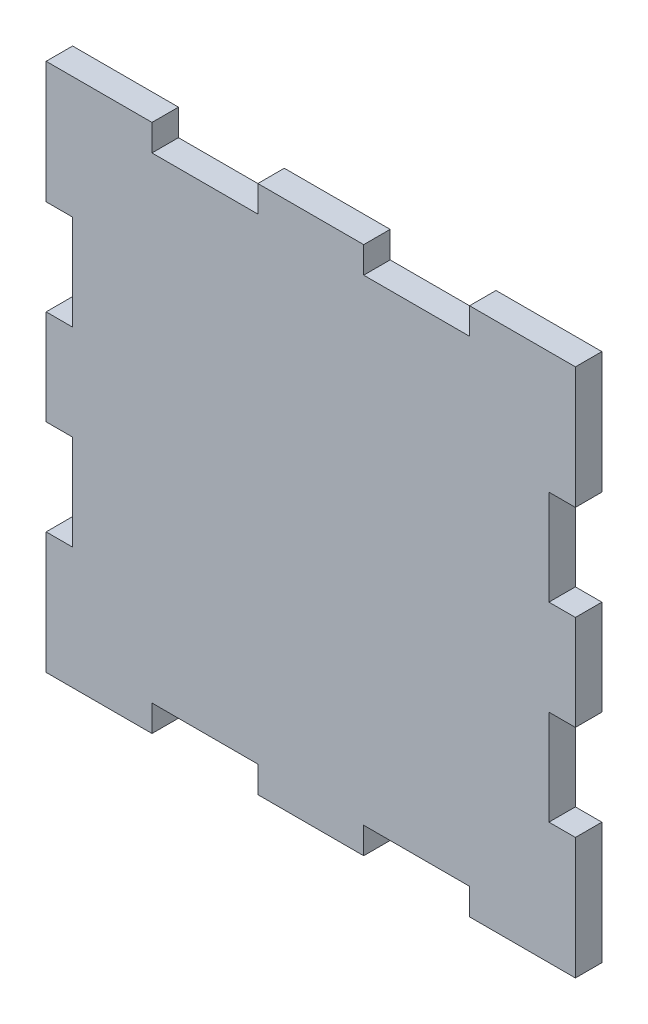
ISO-10303-21;
HEADER;
FILE_DESCRIPTION(('STEP AP214'),'2;1');
FILE_NAME('part.step','',(''),(''),'','','');
FILE_SCHEMA(('AUTOMOTIVE_DESIGN { 1 0 10303 214 1 1 1 1 }'));
ENDSEC;
DATA;
#1=APPLICATION_CONTEXT('core data for automotive mechanical design processes');
#2=APPLICATION_PROTOCOL_DEFINITION('international standard','automotive_design',2000,#1);
#3=PRODUCT_CONTEXT('',#1,'mechanical');
#4=PRODUCT('Part','Part','',(#3));
#5=PRODUCT_RELATED_PRODUCT_CATEGORY('part','',(#4));
#6=PRODUCT_DEFINITION_FORMATION('','',#4);
#7=PRODUCT_DEFINITION_CONTEXT('part definition',#1,'design');
#8=PRODUCT_DEFINITION('design','',#6,#7);
#9=PRODUCT_DEFINITION_SHAPE('','',#8);
#10=(LENGTH_UNIT() NAMED_UNIT(*) SI_UNIT(.MILLI.,.METRE.));
#11=(NAMED_UNIT(*) PLANE_ANGLE_UNIT() SI_UNIT($,.RADIAN.));
#12=(NAMED_UNIT(*) SI_UNIT($,.STERADIAN.) SOLID_ANGLE_UNIT());
#13=UNCERTAINTY_MEASURE_WITH_UNIT(LENGTH_MEASURE(1.E-05),#10,'distance_accuracy_value','');
#14=(GEOMETRIC_REPRESENTATION_CONTEXT(3) GLOBAL_UNCERTAINTY_ASSIGNED_CONTEXT((#13)) GLOBAL_UNIT_ASSIGNED_CONTEXT((#10,
#11,#12)) REPRESENTATION_CONTEXT('',''));
#15=CARTESIAN_POINT('',(0.,0.,0.));
#16=DIRECTION('',(0.,0.,1.));
#17=DIRECTION('',(1.,0.,0.));
#18=AXIS2_PLACEMENT_3D('',#15,#16,#17);
#19=CARTESIAN_POINT('',(0.,0.,5.));
#20=DIRECTION('',(-1.,0.,0.));
#21=DIRECTION('',(0.,0.,1.));
#22=AXIS2_PLACEMENT_3D('',#19,#20,#21);
#23=PLANE('',#22);
#24=DIRECTION('',(0.,1.,0.));
#25=VECTOR('',#24,1.);
#26=CARTESIAN_POINT('',(0.,0.,0.));
#27=LINE('',#26,#25);
#28=CARTESIAN_POINT('',(0.,-59.,0.));
#29=VERTEX_POINT('',#28);
#30=CARTESIAN_POINT('',(0.,-41.,0.));
#31=VERTEX_POINT('',#30);
#32=EDGE_CURVE('E507',#29,#31,#27,.T.);
#33=ORIENTED_EDGE('',*,*,#32,.T.);
#34=DIRECTION('',(0.,0.,-1.));
#35=VECTOR('',#34,1.);
#36=CARTESIAN_POINT('',(0.,-41.,5.));
#37=LINE('',#36,#35);
#38=CARTESIAN_POINT('',(0.,-41.,5.));
#39=VERTEX_POINT('',#38);
#40=EDGE_CURVE('E298',#39,#31,#37,.T.);
#41=ORIENTED_EDGE('',*,*,#40,.F.);
#42=DIRECTION('',(0.,1.,0.));
#43=VECTOR('',#42,1.);
#44=CARTESIAN_POINT('',(0.,0.,5.));
#45=LINE('',#44,#43);
#46=CARTESIAN_POINT('',(0.,-59.,5.));
#47=VERTEX_POINT('',#46);
#48=EDGE_CURVE('E487',#47,#39,#45,.T.);
#49=ORIENTED_EDGE('',*,*,#48,.F.);
#50=DIRECTION('',(0.,0.,-1.));
#51=VECTOR('',#50,1.);
#52=CARTESIAN_POINT('',(0.,-59.,5.));
#53=LINE('',#52,#51);
#54=EDGE_CURVE('E350',#47,#29,#53,.T.);
#55=ORIENTED_EDGE('',*,*,#54,.T.);
#56=EDGE_LOOP('',(#33,#41,#49,#55));
#57=FACE_BOUND('',#56,.T.);
#58=ADVANCED_FACE('F33',(#57),#23,.F.);
#59=CARTESIAN_POINT('',(0.,-100.,0.));
#60=VERTEX_POINT('',#59);
#61=CARTESIAN_POINT('',(0.,-77.,0.));
#62=VERTEX_POINT('',#61);
#63=EDGE_CURVE('E503',#60,#62,#27,.T.);
#64=ORIENTED_EDGE('',*,*,#63,.T.);
#65=DIRECTION('',(0.,0.,-1.));
#66=VECTOR('',#65,1.);
#67=CARTESIAN_POINT('',(0.,-77.,5.));
#68=LINE('',#67,#66);
#69=CARTESIAN_POINT('',(0.,-77.,5.));
#70=VERTEX_POINT('',#69);
#71=EDGE_CURVE('E320',#70,#62,#68,.T.);
#72=ORIENTED_EDGE('',*,*,#71,.F.);
#73=CARTESIAN_POINT('',(0.,-100.,5.));
#74=VERTEX_POINT('',#73);
#75=EDGE_CURVE('E483',#74,#70,#45,.T.);
#76=ORIENTED_EDGE('',*,*,#75,.F.);
#77=DIRECTION('',(0.,0.,-1.));
#78=VECTOR('',#77,1.);
#79=CARTESIAN_POINT('',(0.,-100.,5.));
#80=LINE('',#79,#78);
#81=EDGE_CURVE('E501',#74,#60,#80,.T.);
#82=ORIENTED_EDGE('',*,*,#81,.T.);
#83=EDGE_LOOP('',(#64,#72,#76,#82));
#84=FACE_BOUND('',#83,.T.);
#85=ADVANCED_FACE('F575',(#84),#23,.F.);
#86=CARTESIAN_POINT('',(0.,0.,5.));
#87=DIRECTION('',(0.,-1.,0.));
#88=DIRECTION('',(0.,0.,-1.));
#89=AXIS2_PLACEMENT_3D('',#86,#87,#88);
#90=PLANE('',#89);
#91=DIRECTION('',(-1.,0.,0.));
#92=VECTOR('',#91,1.);
#93=CARTESIAN_POINT('',(0.,0.,0.));
#94=LINE('',#93,#92);
#95=CARTESIAN_POINT('',(0.,0.,0.));
#96=VERTEX_POINT('',#95);
#97=CARTESIAN_POINT('',(-20.,0.,0.));
#98=VERTEX_POINT('',#97);
#99=EDGE_CURVE('E508',#96,#98,#94,.T.);
#100=ORIENTED_EDGE('',*,*,#99,.T.);
#101=DIRECTION('',(0.,0.,-1.));
#102=VECTOR('',#101,1.);
#103=CARTESIAN_POINT('',(-20.,0.,5.));
#104=LINE('',#103,#102);
#105=CARTESIAN_POINT('',(-20.,0.,5.));
#106=VERTEX_POINT('',#105);
#107=EDGE_CURVE('E401',#106,#98,#104,.T.);
#108=ORIENTED_EDGE('',*,*,#107,.F.);
#109=DIRECTION('',(-1.,0.,0.));
#110=VECTOR('',#109,1.);
#111=CARTESIAN_POINT('',(0.,0.,5.));
#112=LINE('',#111,#110);
#113=CARTESIAN_POINT('',(0.,0.,5.));
#114=VERTEX_POINT('',#113);
#115=EDGE_CURVE('E489',#114,#106,#112,.T.);
#116=ORIENTED_EDGE('',*,*,#115,.F.);
#117=DIRECTION('',(0.,0.,-1.));
#118=VECTOR('',#117,1.);
#119=CARTESIAN_POINT('',(0.,0.,5.));
#120=LINE('',#119,#118);
#121=EDGE_CURVE('E11',#114,#96,#120,.T.);
#122=ORIENTED_EDGE('',*,*,#121,.T.);
#123=EDGE_LOOP('',(#100,#108,#116,#122));
#124=FACE_BOUND('',#123,.T.);
#125=ADVANCED_FACE('F564',(#124),#90,.F.);
#126=CARTESIAN_POINT('',(-40.,0.,5.));
#127=VERTEX_POINT('',#126);
#128=CARTESIAN_POINT('',(-60.,0.,5.));
#129=VERTEX_POINT('',#128);
#130=EDGE_CURVE('E493',#127,#129,#112,.T.);
#131=ORIENTED_EDGE('',*,*,#130,.F.);
#132=DIRECTION('',(0.,0.,-1.));
#133=VECTOR('',#132,1.);
#134=CARTESIAN_POINT('',(-40.,0.,5.));
#135=LINE('',#134,#133);
#136=CARTESIAN_POINT('',(-40.,0.,0.));
#137=VERTEX_POINT('',#136);
#138=EDGE_CURVE('E403',#127,#137,#135,.T.);
#139=ORIENTED_EDGE('',*,*,#138,.T.);
#140=CARTESIAN_POINT('',(-60.,0.,0.));
#141=VERTEX_POINT('',#140);
#142=EDGE_CURVE('E512',#137,#141,#94,.T.);
#143=ORIENTED_EDGE('',*,*,#142,.T.);
#144=DIRECTION('',(0.,0.,-1.));
#145=VECTOR('',#144,1.);
#146=CARTESIAN_POINT('',(-60.,0.,5.));
#147=LINE('',#146,#145);
#148=EDGE_CURVE('E426',#129,#141,#147,.T.);
#149=ORIENTED_EDGE('',*,*,#148,.F.);
#150=EDGE_LOOP('',(#131,#139,#143,#149));
#151=FACE_BOUND('',#150,.T.);
#152=ADVANCED_FACE('F548',(#151),#90,.F.);
#153=CARTESIAN_POINT('',(-100.,0.,5.));
#154=DIRECTION('',(1.,0.,0.));
#155=DIRECTION('',(0.,0.,-1.));
#156=AXIS2_PLACEMENT_3D('',#153,#154,#155);
#157=PLANE('',#156);
#158=DIRECTION('',(0.,-1.,0.));
#159=VECTOR('',#158,1.);
#160=CARTESIAN_POINT('',(-100.,0.,0.));
#161=LINE('',#160,#159);
#162=CARTESIAN_POINT('',(-100.,-41.,0.));
#163=VERTEX_POINT('',#162);
#164=CARTESIAN_POINT('',(-100.,-59.,0.));
#165=VERTEX_POINT('',#164);
#166=EDGE_CURVE('E517',#163,#165,#161,.T.);
#167=ORIENTED_EDGE('',*,*,#166,.T.);
#168=DIRECTION('',(0.,0.,-1.));
#169=VECTOR('',#168,1.);
#170=CARTESIAN_POINT('',(-100.,-59.,5.));
#171=LINE('',#170,#169);
#172=CARTESIAN_POINT('',(-100.,-59.,5.));
#173=VERTEX_POINT('',#172);
#174=EDGE_CURVE('E450',#173,#165,#171,.T.);
#175=ORIENTED_EDGE('',*,*,#174,.F.);
#176=DIRECTION('',(0.,-1.,0.));
#177=VECTOR('',#176,1.);
#178=CARTESIAN_POINT('',(-100.,0.,5.));
#179=LINE('',#178,#177);
#180=CARTESIAN_POINT('',(-100.,-41.,5.));
#181=VERTEX_POINT('',#180);
#182=EDGE_CURVE('E497',#181,#173,#179,.T.);
#183=ORIENTED_EDGE('',*,*,#182,.F.);
#184=DIRECTION('',(0.,0.,-1.));
#185=VECTOR('',#184,1.);
#186=CARTESIAN_POINT('',(-100.,-41.,5.));
#187=LINE('',#186,#185);
#188=EDGE_CURVE('E276',#181,#163,#187,.T.);
#189=ORIENTED_EDGE('',*,*,#188,.T.);
#190=EDGE_LOOP('',(#167,#175,#183,#189));
#191=FACE_BOUND('',#190,.T.);
#192=ADVANCED_FACE('F572',(#191),#157,.F.);
#193=CARTESIAN_POINT('',(-100.,0.,0.));
#194=VERTEX_POINT('',#193);
#195=CARTESIAN_POINT('',(-100.,-23.,0.));
#196=VERTEX_POINT('',#195);
#197=EDGE_CURVE('E513',#194,#196,#161,.T.);
#198=ORIENTED_EDGE('',*,*,#197,.T.);
#199=DIRECTION('',(0.,0.,-1.));
#200=VECTOR('',#199,1.);
#201=CARTESIAN_POINT('',(-100.,-23.,5.));
#202=LINE('',#201,#200);
#203=CARTESIAN_POINT('',(-100.,-23.,5.));
#204=VERTEX_POINT('',#203);
#205=EDGE_CURVE('E303',#204,#196,#202,.T.);
#206=ORIENTED_EDGE('',*,*,#205,.F.);
#207=CARTESIAN_POINT('',(-100.,0.,5.));
#208=VERTEX_POINT('',#207);
#209=EDGE_CURVE('E494',#208,#204,#179,.T.);
#210=ORIENTED_EDGE('',*,*,#209,.F.);
#211=DIRECTION('',(0.,0.,-1.));
#212=VECTOR('',#211,1.);
#213=CARTESIAN_POINT('',(-100.,0.,5.));
#214=LINE('',#213,#212);
#215=EDGE_CURVE('E41',#208,#194,#214,.T.);
#216=ORIENTED_EDGE('',*,*,#215,.T.);
#217=EDGE_LOOP('',(#198,#206,#210,#216));
#218=FACE_BOUND('',#217,.T.);
#219=ADVANCED_FACE('F531',(#218),#157,.F.);
#220=CARTESIAN_POINT('',(0.,-100.,5.));
#221=DIRECTION('',(0.,1.,0.));
#222=DIRECTION('',(0.,0.,1.));
#223=AXIS2_PLACEMENT_3D('',#220,#221,#222);
#224=PLANE('',#223);
#225=DIRECTION('',(1.,0.,0.));
#226=VECTOR('',#225,1.);
#227=CARTESIAN_POINT('',(0.,-100.,0.));
#228=LINE('',#227,#226);
#229=CARTESIAN_POINT('',(-60.,-100.,0.));
#230=VERTEX_POINT('',#229);
#231=CARTESIAN_POINT('',(-40.,-100.,0.));
#232=VERTEX_POINT('',#231);
#233=EDGE_CURVE('E521',#230,#232,#228,.T.);
#234=ORIENTED_EDGE('',*,*,#233,.T.);
#235=DIRECTION('',(0.,0.,-1.));
#236=VECTOR('',#235,1.);
#237=CARTESIAN_POINT('',(-40.,-100.,5.));
#238=LINE('',#237,#236);
#239=CARTESIAN_POINT('',(-40.,-100.,5.));
#240=VERTEX_POINT('',#239);
#241=EDGE_CURVE('E374',#240,#232,#238,.T.);
#242=ORIENTED_EDGE('',*,*,#241,.F.);
#243=DIRECTION('',(1.,0.,0.));
#244=VECTOR('',#243,1.);
#245=CARTESIAN_POINT('',(0.,-100.,5.));
#246=LINE('',#245,#244);
#247=CARTESIAN_POINT('',(-60.,-100.,5.));
#248=VERTEX_POINT('',#247);
#249=EDGE_CURVE('E502',#248,#240,#246,.T.);
#250=ORIENTED_EDGE('',*,*,#249,.F.);
#251=DIRECTION('',(0.,0.,-1.));
#252=VECTOR('',#251,1.);
#253=CARTESIAN_POINT('',(-60.,-100.,5.));
#254=LINE('',#253,#252);
#255=EDGE_CURVE('E476',#248,#230,#254,.T.);
#256=ORIENTED_EDGE('',*,*,#255,.T.);
#257=EDGE_LOOP('',(#234,#242,#250,#256));
#258=FACE_BOUND('',#257,.T.);
#259=ADVANCED_FACE('F625',(#258),#224,.F.);
#260=CARTESIAN_POINT('',(-100.,-100.,0.));
#261=VERTEX_POINT('',#260);
#262=CARTESIAN_POINT('',(-80.,-100.,0.));
#263=VERTEX_POINT('',#262);
#264=EDGE_CURVE('E518',#261,#263,#228,.T.);
#265=ORIENTED_EDGE('',*,*,#264,.T.);
#266=DIRECTION('',(0.,0.,-1.));
#267=VECTOR('',#266,1.);
#268=CARTESIAN_POINT('',(-80.,-100.,5.));
#269=LINE('',#268,#267);
#270=CARTESIAN_POINT('',(-80.,-100.,5.));
#271=VERTEX_POINT('',#270);
#272=EDGE_CURVE('E473',#271,#263,#269,.T.);
#273=ORIENTED_EDGE('',*,*,#272,.F.);
#274=CARTESIAN_POINT('',(-100.,-100.,5.));
#275=VERTEX_POINT('',#274);
#276=EDGE_CURVE('E498',#275,#271,#246,.T.);
#277=ORIENTED_EDGE('',*,*,#276,.F.);
#278=DIRECTION('',(0.,0.,-1.));
#279=VECTOR('',#278,1.);
#280=CARTESIAN_POINT('',(-100.,-100.,5.));
#281=LINE('',#280,#279);
#282=EDGE_CURVE('E524',#275,#261,#281,.T.);
#283=ORIENTED_EDGE('',*,*,#282,.T.);
#284=EDGE_LOOP('',(#265,#273,#277,#283));
#285=FACE_BOUND('',#284,.T.);
#286=ADVANCED_FACE('F573',(#285),#224,.F.);
#287=CARTESIAN_POINT('',(0.,-23.,5.));
#288=VERTEX_POINT('',#287);
#289=EDGE_CURVE('E488',#288,#114,#45,.T.);
#290=ORIENTED_EDGE('',*,*,#289,.F.);
#291=DIRECTION('',(0.,0.,-1.));
#292=VECTOR('',#291,1.);
#293=CARTESIAN_POINT('',(0.,-23.,5.));
#294=LINE('',#293,#292);
#295=CARTESIAN_POINT('',(0.,-23.,0.));
#296=VERTEX_POINT('',#295);
#297=EDGE_CURVE('E325',#288,#296,#294,.T.);
#298=ORIENTED_EDGE('',*,*,#297,.T.);
#299=EDGE_CURVE('E475',#296,#96,#27,.T.);
#300=ORIENTED_EDGE('',*,*,#299,.T.);
#301=ORIENTED_EDGE('',*,*,#121,.F.);
#302=EDGE_LOOP('',(#290,#298,#300,#301));
#303=FACE_BOUND('',#302,.T.);
#304=ADVANCED_FACE('F35',(#303),#23,.F.);
#305=CARTESIAN_POINT('',(-80.,0.,5.));
#306=VERTEX_POINT('',#305);
#307=EDGE_CURVE('E486',#306,#208,#112,.T.);
#308=ORIENTED_EDGE('',*,*,#307,.F.);
#309=DIRECTION('',(0.,0.,-1.));
#310=VECTOR('',#309,1.);
#311=CARTESIAN_POINT('',(-80.,0.,5.));
#312=LINE('',#311,#310);
#313=CARTESIAN_POINT('',(-80.,0.,0.));
#314=VERTEX_POINT('',#313);
#315=EDGE_CURVE('E428',#306,#314,#312,.T.);
#316=ORIENTED_EDGE('',*,*,#315,.T.);
#317=EDGE_CURVE('E506',#314,#194,#94,.T.);
#318=ORIENTED_EDGE('',*,*,#317,.T.);
#319=ORIENTED_EDGE('',*,*,#215,.F.);
#320=EDGE_LOOP('',(#308,#316,#318,#319));
#321=FACE_BOUND('',#320,.T.);
#322=ADVANCED_FACE('F561',(#321),#90,.F.);
#323=CARTESIAN_POINT('',(-100.,-77.,5.));
#324=VERTEX_POINT('',#323);
#325=EDGE_CURVE('E492',#324,#275,#179,.T.);
#326=ORIENTED_EDGE('',*,*,#325,.F.);
#327=DIRECTION('',(0.,0.,-1.));
#328=VECTOR('',#327,1.);
#329=CARTESIAN_POINT('',(-100.,-77.,5.));
#330=LINE('',#329,#328);
#331=CARTESIAN_POINT('',(-100.,-77.,0.));
#332=VERTEX_POINT('',#331);
#333=EDGE_CURVE('E452',#324,#332,#330,.T.);
#334=ORIENTED_EDGE('',*,*,#333,.T.);
#335=EDGE_CURVE('E511',#332,#261,#161,.T.);
#336=ORIENTED_EDGE('',*,*,#335,.T.);
#337=ORIENTED_EDGE('',*,*,#282,.F.);
#338=EDGE_LOOP('',(#326,#334,#336,#337));
#339=FACE_BOUND('',#338,.T.);
#340=ADVANCED_FACE('F563',(#339),#157,.F.);
#341=CARTESIAN_POINT('',(-20.,-100.,5.));
#342=VERTEX_POINT('',#341);
#343=EDGE_CURVE('E496',#342,#74,#246,.T.);
#344=ORIENTED_EDGE('',*,*,#343,.F.);
#345=DIRECTION('',(0.,0.,-1.));
#346=VECTOR('',#345,1.);
#347=CARTESIAN_POINT('',(-20.,-100.,5.));
#348=LINE('',#347,#346);
#349=CARTESIAN_POINT('',(-20.,-100.,0.));
#350=VERTEX_POINT('',#349);
#351=EDGE_CURVE('E377',#342,#350,#348,.T.);
#352=ORIENTED_EDGE('',*,*,#351,.T.);
#353=EDGE_CURVE('E516',#350,#60,#228,.T.);
#354=ORIENTED_EDGE('',*,*,#353,.T.);
#355=ORIENTED_EDGE('',*,*,#81,.F.);
#356=EDGE_LOOP('',(#344,#352,#354,#355));
#357=FACE_BOUND('',#356,.T.);
#358=ADVANCED_FACE('F569',(#357),#224,.F.);
#359=CARTESIAN_POINT('',(0.,0.,5.));
#360=DIRECTION('',(0.,0.,-1.));
#361=DIRECTION('',(-1.,0.,0.));
#362=AXIS2_PLACEMENT_3D('',#359,#360,#361);
#363=PLANE('',#362);
#364=ORIENTED_EDGE('',*,*,#249,.T.);
#365=DIRECTION('',(0.,1.,0.));
#366=VECTOR('',#365,1.);
#367=CARTESIAN_POINT('',(-40.,-95.0000000000003,5.));
#368=LINE('',#367,#366);
#369=CARTESIAN_POINT('',(-40.,-95.0000000000003,5.));
#370=VERTEX_POINT('',#369);
#371=EDGE_CURVE('E357',#240,#370,#368,.T.);
#372=ORIENTED_EDGE('',*,*,#371,.T.);
#373=DIRECTION('',(1.,0.,0.));
#374=VECTOR('',#373,1.);
#375=CARTESIAN_POINT('',(-40.,-95.0000000000003,5.));
#376=LINE('',#375,#374);
#377=CARTESIAN_POINT('',(-20.,-95.0000000000003,5.));
#378=VERTEX_POINT('',#377);
#379=EDGE_CURVE('E360',#370,#378,#376,.T.);
#380=ORIENTED_EDGE('',*,*,#379,.T.);
#381=DIRECTION('',(0.,-1.,0.));
#382=VECTOR('',#381,1.);
#383=CARTESIAN_POINT('',(-20.,-95.0000000000003,5.));
#384=LINE('',#383,#382);
#385=EDGE_CURVE('E364',#378,#342,#384,.T.);
#386=ORIENTED_EDGE('',*,*,#385,.T.);
#387=ORIENTED_EDGE('',*,*,#343,.T.);
#388=ORIENTED_EDGE('',*,*,#75,.T.);
#389=DIRECTION('',(-1.,0.,0.));
#390=VECTOR('',#389,1.);
#391=CARTESIAN_POINT('',(-4.99999999999973,-77.,5.));
#392=LINE('',#391,#390);
#393=CARTESIAN_POINT('',(-4.99999999999973,-77.,5.));
#394=VERTEX_POINT('',#393);
#395=EDGE_CURVE('E332',#70,#394,#392,.T.);
#396=ORIENTED_EDGE('',*,*,#395,.T.);
#397=DIRECTION('',(0.,1.,0.));
#398=VECTOR('',#397,1.);
#399=CARTESIAN_POINT('',(-4.99999999999973,-77.,5.));
#400=LINE('',#399,#398);
#401=CARTESIAN_POINT('',(-4.99999999999973,-59.,5.));
#402=VERTEX_POINT('',#401);
#403=EDGE_CURVE('E335',#394,#402,#400,.T.);
#404=ORIENTED_EDGE('',*,*,#403,.T.);
#405=DIRECTION('',(1.,0.,0.));
#406=VECTOR('',#405,1.);
#407=CARTESIAN_POINT('',(-4.99999999999973,-59.,5.));
#408=LINE('',#407,#406);
#409=EDGE_CURVE('E339',#402,#47,#408,.T.);
#410=ORIENTED_EDGE('',*,*,#409,.T.);
#411=ORIENTED_EDGE('',*,*,#48,.T.);
#412=DIRECTION('',(-1.,0.,0.));
#413=VECTOR('',#412,1.);
#414=CARTESIAN_POINT('',(-4.99999999999985,-41.,5.));
#415=LINE('',#414,#413);
#416=CARTESIAN_POINT('',(-4.99999999999985,-41.,5.));
#417=VERTEX_POINT('',#416);
#418=EDGE_CURVE('E306',#39,#417,#415,.T.);
#419=ORIENTED_EDGE('',*,*,#418,.T.);
#420=DIRECTION('',(0.,1.,0.));
#421=VECTOR('',#420,1.);
#422=CARTESIAN_POINT('',(-4.99999999999985,-41.,5.));
#423=LINE('',#422,#421);
#424=CARTESIAN_POINT('',(-4.99999999999985,-23.,5.));
#425=VERTEX_POINT('',#424);
#426=EDGE_CURVE('E309',#417,#425,#423,.T.);
#427=ORIENTED_EDGE('',*,*,#426,.T.);
#428=DIRECTION('',(1.,0.,0.));
#429=VECTOR('',#428,1.);
#430=CARTESIAN_POINT('',(-4.99999999999985,-23.,5.));
#431=LINE('',#430,#429);
#432=EDGE_CURVE('E313',#425,#288,#431,.T.);
#433=ORIENTED_EDGE('',*,*,#432,.T.);
#434=ORIENTED_EDGE('',*,*,#289,.T.);
#435=ORIENTED_EDGE('',*,*,#115,.T.);
#436=DIRECTION('',(0.,-1.,0.));
#437=VECTOR('',#436,1.);
#438=CARTESIAN_POINT('',(-20.,-4.99999999999966,5.));
#439=LINE('',#438,#437);
#440=CARTESIAN_POINT('',(-20.,-4.99999999999966,5.));
#441=VERTEX_POINT('',#440);
#442=EDGE_CURVE('E390',#106,#441,#439,.T.);
#443=ORIENTED_EDGE('',*,*,#442,.T.);
#444=DIRECTION('',(-1.,0.,0.));
#445=VECTOR('',#444,1.);
#446=CARTESIAN_POINT('',(-40.,-4.99999999999966,5.));
#447=LINE('',#446,#445);
#448=CARTESIAN_POINT('',(-40.,-4.99999999999966,5.));
#449=VERTEX_POINT('',#448);
#450=EDGE_CURVE('E383',#441,#449,#447,.T.);
#451=ORIENTED_EDGE('',*,*,#450,.T.);
#452=DIRECTION('',(0.,1.,0.));
#453=VECTOR('',#452,1.);
#454=CARTESIAN_POINT('',(-40.,-4.99999999999966,5.));
#455=LINE('',#454,#453);
#456=EDGE_CURVE('E386',#449,#127,#455,.T.);
#457=ORIENTED_EDGE('',*,*,#456,.T.);
#458=ORIENTED_EDGE('',*,*,#130,.T.);
#459=DIRECTION('',(0.,-1.,0.));
#460=VECTOR('',#459,1.);
#461=CARTESIAN_POINT('',(-60.,-4.99999999999966,5.));
#462=LINE('',#461,#460);
#463=CARTESIAN_POINT('',(-60.,-4.99999999999966,5.));
#464=VERTEX_POINT('',#463);
#465=EDGE_CURVE('E414',#129,#464,#462,.T.);
#466=ORIENTED_EDGE('',*,*,#465,.T.);
#467=DIRECTION('',(-1.,0.,0.));
#468=VECTOR('',#467,1.);
#469=CARTESIAN_POINT('',(-80.,-4.99999999999966,5.));
#470=LINE('',#469,#468);
#471=CARTESIAN_POINT('',(-80.,-4.99999999999966,5.));
#472=VERTEX_POINT('',#471);
#473=EDGE_CURVE('E407',#464,#472,#470,.T.);
#474=ORIENTED_EDGE('',*,*,#473,.T.);
#475=DIRECTION('',(0.,1.,0.));
#476=VECTOR('',#475,1.);
#477=CARTESIAN_POINT('',(-80.,-4.99999999999966,5.));
#478=LINE('',#477,#476);
#479=EDGE_CURVE('E410',#472,#306,#478,.T.);
#480=ORIENTED_EDGE('',*,*,#479,.T.);
#481=ORIENTED_EDGE('',*,*,#307,.T.);
#482=ORIENTED_EDGE('',*,*,#209,.T.);
#483=DIRECTION('',(1.,0.,0.));
#484=VECTOR('',#483,1.);
#485=CARTESIAN_POINT('',(-95.0000000000002,-23.,5.));
#486=LINE('',#485,#484);
#487=CARTESIAN_POINT('',(-95.0000000000002,-23.,5.));
#488=VERTEX_POINT('',#487);
#489=EDGE_CURVE('E277',#204,#488,#486,.T.);
#490=ORIENTED_EDGE('',*,*,#489,.T.);
#491=DIRECTION('',(0.,-1.,0.));
#492=VECTOR('',#491,1.);
#493=CARTESIAN_POINT('',(-95.0000000000002,-41.,5.));
#494=LINE('',#493,#492);
#495=CARTESIAN_POINT('',(-95.0000000000002,-41.,5.));
#496=VERTEX_POINT('',#495);
#497=EDGE_CURVE('E270',#488,#496,#494,.T.);
#498=ORIENTED_EDGE('',*,*,#497,.T.);
#499=DIRECTION('',(-1.,0.,0.));
#500=VECTOR('',#499,1.);
#501=CARTESIAN_POINT('',(-95.0000000000002,-41.,5.));
#502=LINE('',#501,#500);
#503=EDGE_CURVE('E280',#496,#181,#502,.T.);
#504=ORIENTED_EDGE('',*,*,#503,.T.);
#505=ORIENTED_EDGE('',*,*,#182,.T.);
#506=DIRECTION('',(1.,0.,0.));
#507=VECTOR('',#506,1.);
#508=CARTESIAN_POINT('',(-95.0000000000003,-59.,5.));
#509=LINE('',#508,#507);
#510=CARTESIAN_POINT('',(-95.0000000000003,-59.,5.));
#511=VERTEX_POINT('',#510);
#512=EDGE_CURVE('E440',#173,#511,#509,.T.);
#513=ORIENTED_EDGE('',*,*,#512,.T.);
#514=DIRECTION('',(0.,-1.,0.));
#515=VECTOR('',#514,1.);
#516=CARTESIAN_POINT('',(-95.0000000000003,-77.,5.));
#517=LINE('',#516,#515);
#518=CARTESIAN_POINT('',(-95.0000000000003,-77.,5.));
#519=VERTEX_POINT('',#518);
#520=EDGE_CURVE('E433',#511,#519,#517,.T.);
#521=ORIENTED_EDGE('',*,*,#520,.T.);
#522=DIRECTION('',(-1.,0.,0.));
#523=VECTOR('',#522,1.);
#524=CARTESIAN_POINT('',(-95.0000000000003,-77.,5.));
#525=LINE('',#524,#523);
#526=EDGE_CURVE('E436',#519,#324,#525,.T.);
#527=ORIENTED_EDGE('',*,*,#526,.T.);
#528=ORIENTED_EDGE('',*,*,#325,.T.);
#529=ORIENTED_EDGE('',*,*,#276,.T.);
#530=DIRECTION('',(0.,1.,0.));
#531=VECTOR('',#530,1.);
#532=CARTESIAN_POINT('',(-80.,-95.0000000000003,5.));
#533=LINE('',#532,#531);
#534=CARTESIAN_POINT('',(-80.,-95.0000000000003,5.));
#535=VERTEX_POINT('',#534);
#536=EDGE_CURVE('E457',#271,#535,#533,.T.);
#537=ORIENTED_EDGE('',*,*,#536,.T.);
#538=DIRECTION('',(1.,0.,0.));
#539=VECTOR('',#538,1.);
#540=CARTESIAN_POINT('',(-80.,-95.0000000000003,5.));
#541=LINE('',#540,#539);
#542=CARTESIAN_POINT('',(-60.,-95.0000000000003,5.));
#543=VERTEX_POINT('',#542);
#544=EDGE_CURVE('E460',#535,#543,#541,.T.);
#545=ORIENTED_EDGE('',*,*,#544,.T.);
#546=DIRECTION('',(0.,-1.,0.));
#547=VECTOR('',#546,1.);
#548=CARTESIAN_POINT('',(-60.,-95.0000000000003,5.));
#549=LINE('',#548,#547);
#550=EDGE_CURVE('E464',#543,#248,#549,.T.);
#551=ORIENTED_EDGE('',*,*,#550,.T.);
#552=EDGE_LOOP('',(#364,#372,#380,#386,#387,#388,#396,#404,#410,#411,#419,#427,#433,#434,#435,
#443,#451,#457,#458,#466,#474,#480,#481,#482,#490,#498,#504,#505,#513,#521,#527,#528,#529,#537,
#545,#551));
#553=FACE_BOUND('',#552,.T.);
#554=ADVANCED_FACE('F288',(#553),#363,.F.);
#555=CARTESIAN_POINT('',(0.,0.,0.));
#556=DIRECTION('',(0.,0.,-1.));
#557=DIRECTION('',(-1.,0.,0.));
#558=AXIS2_PLACEMENT_3D('',#555,#556,#557);
#559=PLANE('',#558);
#560=DIRECTION('',(0.,1.,0.));
#561=VECTOR('',#560,1.);
#562=CARTESIAN_POINT('',(-40.,-95.0000000000003,0.));
#563=LINE('',#562,#561);
#564=CARTESIAN_POINT('',(-40.,-95.0000000000003,0.));
#565=VERTEX_POINT('',#564);
#566=EDGE_CURVE('E48',#232,#565,#563,.T.);
#567=ORIENTED_EDGE('',*,*,#566,.F.);
#568=ORIENTED_EDGE('',*,*,#233,.F.);
#569=DIRECTION('',(0.,-1.,0.));
#570=VECTOR('',#569,1.);
#571=CARTESIAN_POINT('',(-60.,-95.0000000000003,0.));
#572=LINE('',#571,#570);
#573=CARTESIAN_POINT('',(-60.,-95.0000000000003,0.));
#574=VERTEX_POINT('',#573);
#575=EDGE_CURVE('E461',#574,#230,#572,.T.);
#576=ORIENTED_EDGE('',*,*,#575,.F.);
#577=DIRECTION('',(1.,0.,0.));
#578=VECTOR('',#577,1.);
#579=CARTESIAN_POINT('',(-80.,-95.0000000000003,0.));
#580=LINE('',#579,#578);
#581=CARTESIAN_POINT('',(-80.,-95.0000000000003,0.));
#582=VERTEX_POINT('',#581);
#583=EDGE_CURVE('E469',#582,#574,#580,.T.);
#584=ORIENTED_EDGE('',*,*,#583,.F.);
#585=DIRECTION('',(0.,1.,0.));
#586=VECTOR('',#585,1.);
#587=CARTESIAN_POINT('',(-80.,-95.0000000000003,0.));
#588=LINE('',#587,#586);
#589=EDGE_CURVE('E376',#263,#582,#588,.T.);
#590=ORIENTED_EDGE('',*,*,#589,.F.);
#591=ORIENTED_EDGE('',*,*,#264,.F.);
#592=ORIENTED_EDGE('',*,*,#335,.F.);
#593=DIRECTION('',(-1.,0.,0.));
#594=VECTOR('',#593,1.);
#595=CARTESIAN_POINT('',(-95.0000000000003,-77.,0.));
#596=LINE('',#595,#594);
#597=CARTESIAN_POINT('',(-95.0000000000003,-77.,0.));
#598=VERTEX_POINT('',#597);
#599=EDGE_CURVE('E445',#598,#332,#596,.T.);
#600=ORIENTED_EDGE('',*,*,#599,.F.);
#601=DIRECTION('',(0.,-1.,0.));
#602=VECTOR('',#601,1.);
#603=CARTESIAN_POINT('',(-95.0000000000003,-77.,0.));
#604=LINE('',#603,#602);
#605=CARTESIAN_POINT('',(-95.0000000000003,-59.,0.));
#606=VERTEX_POINT('',#605);
#607=EDGE_CURVE('E302',#606,#598,#604,.T.);
#608=ORIENTED_EDGE('',*,*,#607,.F.);
#609=DIRECTION('',(1.,0.,0.));
#610=VECTOR('',#609,1.);
#611=CARTESIAN_POINT('',(-95.0000000000003,-59.,0.));
#612=LINE('',#611,#610);
#613=EDGE_CURVE('E437',#165,#606,#612,.T.);
#614=ORIENTED_EDGE('',*,*,#613,.F.);
#615=ORIENTED_EDGE('',*,*,#166,.F.);
#616=DIRECTION('',(-1.,0.,0.));
#617=VECTOR('',#616,1.);
#618=CARTESIAN_POINT('',(-95.0000000000002,-41.,0.));
#619=LINE('',#618,#617);
#620=CARTESIAN_POINT('',(-95.0000000000002,-41.,0.));
#621=VERTEX_POINT('',#620);
#622=EDGE_CURVE('E293',#621,#163,#619,.T.);
#623=ORIENTED_EDGE('',*,*,#622,.F.);
#624=DIRECTION('',(0.,-1.,0.));
#625=VECTOR('',#624,1.);
#626=CARTESIAN_POINT('',(-95.0000000000002,-41.,0.));
#627=LINE('',#626,#625);
#628=CARTESIAN_POINT('',(-95.0000000000002,-23.,0.));
#629=VERTEX_POINT('',#628);
#630=EDGE_CURVE('E273',#629,#621,#627,.T.);
#631=ORIENTED_EDGE('',*,*,#630,.F.);
#632=DIRECTION('',(1.,0.,0.));
#633=VECTOR('',#632,1.);
#634=CARTESIAN_POINT('',(-95.0000000000002,-23.,0.));
#635=LINE('',#634,#633);
#636=EDGE_CURVE('E290',#196,#629,#635,.T.);
#637=ORIENTED_EDGE('',*,*,#636,.F.);
#638=ORIENTED_EDGE('',*,*,#197,.F.);
#639=ORIENTED_EDGE('',*,*,#317,.F.);
#640=DIRECTION('',(0.,1.,0.));
#641=VECTOR('',#640,1.);
#642=CARTESIAN_POINT('',(-80.,-4.99999999999966,0.));
#643=LINE('',#642,#641);
#644=CARTESIAN_POINT('',(-80.,-4.99999999999966,0.));
#645=VERTEX_POINT('',#644);
#646=EDGE_CURVE('E420',#645,#314,#643,.T.);
#647=ORIENTED_EDGE('',*,*,#646,.F.);
#648=DIRECTION('',(-1.,0.,0.));
#649=VECTOR('',#648,1.);
#650=CARTESIAN_POINT('',(-80.,-4.99999999999966,0.));
#651=LINE('',#650,#649);
#652=CARTESIAN_POINT('',(-60.,-4.99999999999966,0.));
#653=VERTEX_POINT('',#652);
#654=EDGE_CURVE('E418',#653,#645,#651,.T.);
#655=ORIENTED_EDGE('',*,*,#654,.F.);
#656=DIRECTION('',(0.,-1.,0.));
#657=VECTOR('',#656,1.);
#658=CARTESIAN_POINT('',(-60.,-4.99999999999966,0.));
#659=LINE('',#658,#657);
#660=EDGE_CURVE('E411',#141,#653,#659,.T.);
#661=ORIENTED_EDGE('',*,*,#660,.F.);
#662=ORIENTED_EDGE('',*,*,#142,.F.);
#663=DIRECTION('',(0.,1.,0.));
#664=VECTOR('',#663,1.);
#665=CARTESIAN_POINT('',(-40.,-4.99999999999966,0.));
#666=LINE('',#665,#664);
#667=CARTESIAN_POINT('',(-40.,-4.99999999999966,0.));
#668=VERTEX_POINT('',#667);
#669=EDGE_CURVE('E395',#668,#137,#666,.T.);
#670=ORIENTED_EDGE('',*,*,#669,.F.);
#671=DIRECTION('',(-1.,0.,0.));
#672=VECTOR('',#671,1.);
#673=CARTESIAN_POINT('',(-40.,-4.99999999999966,0.));
#674=LINE('',#673,#672);
#675=CARTESIAN_POINT('',(-20.,-4.99999999999966,0.));
#676=VERTEX_POINT('',#675);
#677=EDGE_CURVE('E56',#676,#668,#674,.T.);
#678=ORIENTED_EDGE('',*,*,#677,.F.);
#679=DIRECTION('',(0.,-1.,0.));
#680=VECTOR('',#679,1.);
#681=CARTESIAN_POINT('',(-20.,-4.99999999999966,0.));
#682=LINE('',#681,#680);
#683=EDGE_CURVE('E387',#98,#676,#682,.T.);
#684=ORIENTED_EDGE('',*,*,#683,.F.);
#685=ORIENTED_EDGE('',*,*,#99,.F.);
#686=ORIENTED_EDGE('',*,*,#299,.F.);
#687=DIRECTION('',(1.,0.,0.));
#688=VECTOR('',#687,1.);
#689=CARTESIAN_POINT('',(-4.99999999999985,-23.,0.));
#690=LINE('',#689,#688);
#691=CARTESIAN_POINT('',(-4.99999999999985,-23.,0.));
#692=VERTEX_POINT('',#691);
#693=EDGE_CURVE('E310',#692,#296,#690,.T.);
#694=ORIENTED_EDGE('',*,*,#693,.F.);
#695=DIRECTION('',(0.,1.,0.));
#696=VECTOR('',#695,1.);
#697=CARTESIAN_POINT('',(-4.99999999999985,-41.,0.));
#698=LINE('',#697,#696);
#699=CARTESIAN_POINT('',(-4.99999999999985,-41.,0.));
#700=VERTEX_POINT('',#699);
#701=EDGE_CURVE('E319',#700,#692,#698,.T.);
#702=ORIENTED_EDGE('',*,*,#701,.F.);
#703=DIRECTION('',(-1.,0.,0.));
#704=VECTOR('',#703,1.);
#705=CARTESIAN_POINT('',(-4.99999999999985,-41.,0.));
#706=LINE('',#705,#704);
#707=EDGE_CURVE('E317',#31,#700,#706,.T.);
#708=ORIENTED_EDGE('',*,*,#707,.F.);
#709=ORIENTED_EDGE('',*,*,#32,.F.);
#710=DIRECTION('',(1.,0.,0.));
#711=VECTOR('',#710,1.);
#712=CARTESIAN_POINT('',(-4.99999999999973,-59.,0.));
#713=LINE('',#712,#711);
#714=CARTESIAN_POINT('',(-4.99999999999973,-59.,0.));
#715=VERTEX_POINT('',#714);
#716=EDGE_CURVE('E336',#715,#29,#713,.T.);
#717=ORIENTED_EDGE('',*,*,#716,.F.);
#718=DIRECTION('',(0.,1.,0.));
#719=VECTOR('',#718,1.);
#720=CARTESIAN_POINT('',(-4.99999999999973,-77.,0.));
#721=LINE('',#720,#719);
#722=CARTESIAN_POINT('',(-4.99999999999973,-77.,0.));
#723=VERTEX_POINT('',#722);
#724=EDGE_CURVE('E345',#723,#715,#721,.T.);
#725=ORIENTED_EDGE('',*,*,#724,.F.);
#726=DIRECTION('',(-1.,0.,0.));
#727=VECTOR('',#726,1.);
#728=CARTESIAN_POINT('',(-4.99999999999973,-77.,0.));
#729=LINE('',#728,#727);
#730=EDGE_CURVE('E343',#62,#723,#729,.T.);
#731=ORIENTED_EDGE('',*,*,#730,.F.);
#732=ORIENTED_EDGE('',*,*,#63,.F.);
#733=ORIENTED_EDGE('',*,*,#353,.F.);
#734=DIRECTION('',(0.,-1.,0.));
#735=VECTOR('',#734,1.);
#736=CARTESIAN_POINT('',(-20.,-95.0000000000003,0.));
#737=LINE('',#736,#735);
#738=CARTESIAN_POINT('',(-20.,-95.0000000000003,0.));
#739=VERTEX_POINT('',#738);
#740=EDGE_CURVE('E361',#739,#350,#737,.T.);
#741=ORIENTED_EDGE('',*,*,#740,.F.);
#742=DIRECTION('',(1.,0.,0.));
#743=VECTOR('',#742,1.);
#744=CARTESIAN_POINT('',(-40.,-95.0000000000003,0.));
#745=LINE('',#744,#743);
#746=EDGE_CURVE('E369',#565,#739,#745,.T.);
#747=ORIENTED_EDGE('',*,*,#746,.F.);
#748=EDGE_LOOP('',(#567,#568,#576,#584,#590,#591,#592,#600,#608,#614,#615,#623,#631,#637,#638,
#639,#647,#655,#661,#662,#670,#678,#684,#685,#686,#694,#702,#708,#709,#717,#725,#731,#732,#733,
#741,#747));
#749=FACE_BOUND('',#748,.T.);
#750=ADVANCED_FACE('F538',(#749),#559,.T.);
#751=CARTESIAN_POINT('',(-80.,-95.0000000000003,5.));
#752=DIRECTION('',(-1.,0.,0.));
#753=DIRECTION('',(0.,0.,1.));
#754=AXIS2_PLACEMENT_3D('',#751,#752,#753);
#755=PLANE('',#754);
#756=ORIENTED_EDGE('',*,*,#589,.T.);
#757=DIRECTION('',(0.,0.,-1.));
#758=VECTOR('',#757,1.);
#759=CARTESIAN_POINT('',(-80.,-95.0000000000003,5.));
#760=LINE('',#759,#758);
#761=EDGE_CURVE('E467',#535,#582,#760,.T.);
#762=ORIENTED_EDGE('',*,*,#761,.F.);
#763=ORIENTED_EDGE('',*,*,#536,.F.);
#764=ORIENTED_EDGE('',*,*,#272,.T.);
#765=EDGE_LOOP('',(#756,#762,#763,#764));
#766=FACE_BOUND('',#765,.T.);
#767=ADVANCED_FACE('F675',(#766),#755,.F.);
#768=CARTESIAN_POINT('',(-60.,-95.0000000000003,5.));
#769=DIRECTION('',(1.,0.,0.));
#770=DIRECTION('',(0.,0.,-1.));
#771=AXIS2_PLACEMENT_3D('',#768,#769,#770);
#772=PLANE('',#771);
#773=ORIENTED_EDGE('',*,*,#575,.T.);
#774=ORIENTED_EDGE('',*,*,#255,.F.);
#775=ORIENTED_EDGE('',*,*,#550,.F.);
#776=DIRECTION('',(0.,0.,-1.));
#777=VECTOR('',#776,1.);
#778=CARTESIAN_POINT('',(-60.,-95.0000000000003,5.));
#779=LINE('',#778,#777);
#780=EDGE_CURVE('E479',#543,#574,#779,.T.);
#781=ORIENTED_EDGE('',*,*,#780,.T.);
#782=EDGE_LOOP('',(#773,#774,#775,#781));
#783=FACE_BOUND('',#782,.T.);
#784=ADVANCED_FACE('F636',(#783),#772,.F.);
#785=CARTESIAN_POINT('',(-80.,-95.0000000000003,5.));
#786=DIRECTION('',(0.,1.,0.));
#787=DIRECTION('',(0.,0.,1.));
#788=AXIS2_PLACEMENT_3D('',#785,#786,#787);
#789=PLANE('',#788);
#790=ORIENTED_EDGE('',*,*,#583,.T.);
#791=ORIENTED_EDGE('',*,*,#780,.F.);
#792=ORIENTED_EDGE('',*,*,#544,.F.);
#793=ORIENTED_EDGE('',*,*,#761,.T.);
#794=EDGE_LOOP('',(#790,#791,#792,#793));
#795=FACE_BOUND('',#794,.T.);
#796=ADVANCED_FACE('F638',(#795),#789,.F.);
#797=CARTESIAN_POINT('',(-4.99999999999973,-77.,5.));
#798=DIRECTION('',(0.,-1.,0.));
#799=DIRECTION('',(0.,0.,-1.));
#800=AXIS2_PLACEMENT_3D('',#797,#798,#799);
#801=PLANE('',#800);
#802=ORIENTED_EDGE('',*,*,#730,.T.);
#803=DIRECTION('',(0.,0.,-1.));
#804=VECTOR('',#803,1.);
#805=CARTESIAN_POINT('',(-4.99999999999973,-77.,5.));
#806=LINE('',#805,#804);
#807=EDGE_CURVE('E342',#394,#723,#806,.T.);
#808=ORIENTED_EDGE('',*,*,#807,.F.);
#809=ORIENTED_EDGE('',*,*,#395,.F.);
#810=ORIENTED_EDGE('',*,*,#71,.T.);
#811=EDGE_LOOP('',(#802,#808,#809,#810));
#812=FACE_BOUND('',#811,.T.);
#813=ADVANCED_FACE('F611',(#812),#801,.F.);
#814=CARTESIAN_POINT('',(-4.99999999999973,-59.,5.));
#815=DIRECTION('',(0.,1.,0.));
#816=DIRECTION('',(0.,0.,1.));
#817=AXIS2_PLACEMENT_3D('',#814,#815,#816);
#818=PLANE('',#817);
#819=ORIENTED_EDGE('',*,*,#716,.T.);
#820=ORIENTED_EDGE('',*,*,#54,.F.);
#821=ORIENTED_EDGE('',*,*,#409,.F.);
#822=DIRECTION('',(0.,0.,-1.));
#823=VECTOR('',#822,1.);
#824=CARTESIAN_POINT('',(-4.99999999999973,-59.,5.));
#825=LINE('',#824,#823);
#826=EDGE_CURVE('E353',#402,#715,#825,.T.);
#827=ORIENTED_EDGE('',*,*,#826,.T.);
#828=EDGE_LOOP('',(#819,#820,#821,#827));
#829=FACE_BOUND('',#828,.T.);
#830=ADVANCED_FACE('F604',(#829),#818,.F.);
#831=CARTESIAN_POINT('',(-4.99999999999973,-77.,5.));
#832=DIRECTION('',(-1.,0.,0.));
#833=DIRECTION('',(0.,0.,1.));
#834=AXIS2_PLACEMENT_3D('',#831,#832,#833);
#835=PLANE('',#834);
#836=ORIENTED_EDGE('',*,*,#724,.T.);
#837=ORIENTED_EDGE('',*,*,#826,.F.);
#838=ORIENTED_EDGE('',*,*,#403,.F.);
#839=ORIENTED_EDGE('',*,*,#807,.T.);
#840=EDGE_LOOP('',(#836,#837,#838,#839));
#841=FACE_BOUND('',#840,.T.);
#842=ADVANCED_FACE('F609',(#841),#835,.F.);
#843=CARTESIAN_POINT('',(-4.99999999999985,-41.,5.));
#844=DIRECTION('',(0.,-1.,0.));
#845=DIRECTION('',(0.,0.,-1.));
#846=AXIS2_PLACEMENT_3D('',#843,#844,#845);
#847=PLANE('',#846);
#848=ORIENTED_EDGE('',*,*,#707,.T.);
#849=DIRECTION('',(0.,0.,-1.));
#850=VECTOR('',#849,1.);
#851=CARTESIAN_POINT('',(-4.99999999999985,-41.,5.));
#852=LINE('',#851,#850);
#853=EDGE_CURVE('E316',#417,#700,#852,.T.);
#854=ORIENTED_EDGE('',*,*,#853,.F.);
#855=ORIENTED_EDGE('',*,*,#418,.F.);
#856=ORIENTED_EDGE('',*,*,#40,.T.);
#857=EDGE_LOOP('',(#848,#854,#855,#856));
#858=FACE_BOUND('',#857,.T.);
#859=ADVANCED_FACE('F793',(#858),#847,.F.);
#860=CARTESIAN_POINT('',(-4.99999999999985,-23.,5.));
#861=DIRECTION('',(0.,1.,0.));
#862=DIRECTION('',(0.,0.,1.));
#863=AXIS2_PLACEMENT_3D('',#860,#861,#862);
#864=PLANE('',#863);
#865=ORIENTED_EDGE('',*,*,#693,.T.);
#866=ORIENTED_EDGE('',*,*,#297,.F.);
#867=ORIENTED_EDGE('',*,*,#432,.F.);
#868=DIRECTION('',(0.,0.,-1.));
#869=VECTOR('',#868,1.);
#870=CARTESIAN_POINT('',(-4.99999999999985,-23.,5.));
#871=LINE('',#870,#869);
#872=EDGE_CURVE('E328',#425,#692,#871,.T.);
#873=ORIENTED_EDGE('',*,*,#872,.T.);
#874=EDGE_LOOP('',(#865,#866,#867,#873));
#875=FACE_BOUND('',#874,.T.);
#876=ADVANCED_FACE('F800',(#875),#864,.F.);
#877=CARTESIAN_POINT('',(-4.99999999999985,-41.,5.));
#878=DIRECTION('',(-1.,0.,0.));
#879=DIRECTION('',(0.,0.,1.));
#880=AXIS2_PLACEMENT_3D('',#877,#878,#879);
#881=PLANE('',#880);
#882=ORIENTED_EDGE('',*,*,#701,.T.);
#883=ORIENTED_EDGE('',*,*,#872,.F.);
#884=ORIENTED_EDGE('',*,*,#426,.F.);
#885=ORIENTED_EDGE('',*,*,#853,.T.);
#886=EDGE_LOOP('',(#882,#883,#884,#885));
#887=FACE_BOUND('',#886,.T.);
#888=ADVANCED_FACE('F808',(#887),#881,.F.);
#889=CARTESIAN_POINT('',(-95.0000000000002,-41.,5.));
#890=DIRECTION('',(1.,0.,0.));
#891=DIRECTION('',(0.,0.,-1.));
#892=AXIS2_PLACEMENT_3D('',#889,#890,#891);
#893=PLANE('',#892);
#894=ORIENTED_EDGE('',*,*,#630,.T.);
#895=DIRECTION('',(0.,0.,-1.));
#896=VECTOR('',#895,1.);
#897=CARTESIAN_POINT('',(-95.0000000000002,-41.,5.));
#898=LINE('',#897,#896);
#899=EDGE_CURVE('E266',#496,#621,#898,.T.);
#900=ORIENTED_EDGE('',*,*,#899,.F.);
#901=ORIENTED_EDGE('',*,*,#497,.F.);
#902=DIRECTION('',(0.,0.,-1.));
#903=VECTOR('',#902,1.);
#904=CARTESIAN_POINT('',(-95.0000000000002,-23.,5.));
#905=LINE('',#904,#903);
#906=EDGE_CURVE('E300',#488,#629,#905,.T.);
#907=ORIENTED_EDGE('',*,*,#906,.T.);
#908=EDGE_LOOP('',(#894,#900,#901,#907));
#909=FACE_BOUND('',#908,.T.);
#910=ADVANCED_FACE('F268',(#909),#893,.F.);
#911=CARTESIAN_POINT('',(-95.0000000000002,-23.,5.));
#912=DIRECTION('',(0.,1.,0.));
#913=DIRECTION('',(0.,0.,1.));
#914=AXIS2_PLACEMENT_3D('',#911,#912,#913);
#915=PLANE('',#914);
#916=ORIENTED_EDGE('',*,*,#636,.T.);
#917=ORIENTED_EDGE('',*,*,#906,.F.);
#918=ORIENTED_EDGE('',*,*,#489,.F.);
#919=ORIENTED_EDGE('',*,*,#205,.T.);
#920=EDGE_LOOP('',(#916,#917,#918,#919));
#921=FACE_BOUND('',#920,.T.);
#922=ADVANCED_FACE('F541',(#921),#915,.F.);
#923=CARTESIAN_POINT('',(-95.0000000000002,-41.,5.));
#924=DIRECTION('',(0.,-1.,0.));
#925=DIRECTION('',(0.,0.,-1.));
#926=AXIS2_PLACEMENT_3D('',#923,#924,#925);
#927=PLANE('',#926);
#928=ORIENTED_EDGE('',*,*,#622,.T.);
#929=ORIENTED_EDGE('',*,*,#188,.F.);
#930=ORIENTED_EDGE('',*,*,#503,.F.);
#931=ORIENTED_EDGE('',*,*,#899,.T.);
#932=EDGE_LOOP('',(#928,#929,#930,#931));
#933=FACE_BOUND('',#932,.T.);
#934=ADVANCED_FACE('F281',(#933),#927,.F.);
#935=CARTESIAN_POINT('',(-95.0000000000003,-77.,5.));
#936=DIRECTION('',(1.,0.,0.));
#937=DIRECTION('',(0.,0.,-1.));
#938=AXIS2_PLACEMENT_3D('',#935,#936,#937);
#939=PLANE('',#938);
#940=ORIENTED_EDGE('',*,*,#607,.T.);
#941=DIRECTION('',(0.,0.,-1.));
#942=VECTOR('',#941,1.);
#943=CARTESIAN_POINT('',(-95.0000000000003,-77.,5.));
#944=LINE('',#943,#942);
#945=EDGE_CURVE('E443',#519,#598,#944,.T.);
#946=ORIENTED_EDGE('',*,*,#945,.F.);
#947=ORIENTED_EDGE('',*,*,#520,.F.);
#948=DIRECTION('',(0.,0.,-1.));
#949=VECTOR('',#948,1.);
#950=CARTESIAN_POINT('',(-95.0000000000003,-59.,5.));
#951=LINE('',#950,#949);
#952=EDGE_CURVE('E421',#511,#606,#951,.T.);
#953=ORIENTED_EDGE('',*,*,#952,.T.);
#954=EDGE_LOOP('',(#940,#946,#947,#953));
#955=FACE_BOUND('',#954,.T.);
#956=ADVANCED_FACE('F662',(#955),#939,.F.);
#957=CARTESIAN_POINT('',(-95.0000000000003,-59.,5.));
#958=DIRECTION('',(0.,1.,0.));
#959=DIRECTION('',(0.,0.,1.));
#960=AXIS2_PLACEMENT_3D('',#957,#958,#959);
#961=PLANE('',#960);
#962=ORIENTED_EDGE('',*,*,#613,.T.);
#963=ORIENTED_EDGE('',*,*,#952,.F.);
#964=ORIENTED_EDGE('',*,*,#512,.F.);
#965=ORIENTED_EDGE('',*,*,#174,.T.);
#966=EDGE_LOOP('',(#962,#963,#964,#965));
#967=FACE_BOUND('',#966,.T.);
#968=ADVANCED_FACE('F656',(#967),#961,.F.);
#969=CARTESIAN_POINT('',(-95.0000000000003,-77.,5.));
#970=DIRECTION('',(0.,-1.,0.));
#971=DIRECTION('',(0.,0.,-1.));
#972=AXIS2_PLACEMENT_3D('',#969,#970,#971);
#973=PLANE('',#972);
#974=ORIENTED_EDGE('',*,*,#599,.T.);
#975=ORIENTED_EDGE('',*,*,#333,.F.);
#976=ORIENTED_EDGE('',*,*,#526,.F.);
#977=ORIENTED_EDGE('',*,*,#945,.T.);
#978=EDGE_LOOP('',(#974,#975,#976,#977));
#979=FACE_BOUND('',#978,.T.);
#980=ADVANCED_FACE('F660',(#979),#973,.F.);
#981=CARTESIAN_POINT('',(-80.,-4.99999999999966,5.));
#982=DIRECTION('',(0.,-1.,0.));
#983=DIRECTION('',(0.,0.,-1.));
#984=AXIS2_PLACEMENT_3D('',#981,#982,#983);
#985=PLANE('',#984);
#986=ORIENTED_EDGE('',*,*,#654,.T.);
#987=DIRECTION('',(0.,0.,-1.));
#988=VECTOR('',#987,1.);
#989=CARTESIAN_POINT('',(-80.,-4.99999999999966,5.));
#990=LINE('',#989,#988);
#991=EDGE_CURVE('E417',#472,#645,#990,.T.);
#992=ORIENTED_EDGE('',*,*,#991,.F.);
#993=ORIENTED_EDGE('',*,*,#473,.F.);
#994=DIRECTION('',(0.,0.,-1.));
#995=VECTOR('',#994,1.);
#996=CARTESIAN_POINT('',(-60.,-4.99999999999966,5.));
#997=LINE('',#996,#995);
#998=EDGE_CURVE('E396',#464,#653,#997,.T.);
#999=ORIENTED_EDGE('',*,*,#998,.T.);
#1000=EDGE_LOOP('',(#986,#992,#993,#999));
#1001=FACE_BOUND('',#1000,.T.);
#1002=ADVANCED_FACE('F557',(#1001),#985,.F.);
#1003=CARTESIAN_POINT('',(-60.,-4.99999999999966,5.));
#1004=DIRECTION('',(1.,0.,0.));
#1005=DIRECTION('',(0.,0.,-1.));
#1006=AXIS2_PLACEMENT_3D('',#1003,#1004,#1005);
#1007=PLANE('',#1006);
#1008=ORIENTED_EDGE('',*,*,#660,.T.);
#1009=ORIENTED_EDGE('',*,*,#998,.F.);
#1010=ORIENTED_EDGE('',*,*,#465,.F.);
#1011=ORIENTED_EDGE('',*,*,#148,.T.);
#1012=EDGE_LOOP('',(#1008,#1009,#1010,#1011));
#1013=FACE_BOUND('',#1012,.T.);
#1014=ADVANCED_FACE('F553',(#1013),#1007,.F.);
#1015=CARTESIAN_POINT('',(-80.,-4.99999999999966,5.));
#1016=DIRECTION('',(-1.,0.,0.));
#1017=DIRECTION('',(0.,0.,1.));
#1018=AXIS2_PLACEMENT_3D('',#1015,#1016,#1017);
#1019=PLANE('',#1018);
#1020=ORIENTED_EDGE('',*,*,#646,.T.);
#1021=ORIENTED_EDGE('',*,*,#315,.F.);
#1022=ORIENTED_EDGE('',*,*,#479,.F.);
#1023=ORIENTED_EDGE('',*,*,#991,.T.);
#1024=EDGE_LOOP('',(#1020,#1021,#1022,#1023));
#1025=FACE_BOUND('',#1024,.T.);
#1026=ADVANCED_FACE('F560',(#1025),#1019,.F.);
#1027=CARTESIAN_POINT('',(-40.,-4.99999999999966,5.));
#1028=DIRECTION('',(0.,-1.,0.));
#1029=DIRECTION('',(0.,0.,-1.));
#1030=AXIS2_PLACEMENT_3D('',#1027,#1028,#1029);
#1031=PLANE('',#1030);
#1032=ORIENTED_EDGE('',*,*,#677,.T.);
#1033=DIRECTION('',(0.,0.,-1.));
#1034=VECTOR('',#1033,1.);
#1035=CARTESIAN_POINT('',(-40.,-4.99999999999966,5.));
#1036=LINE('',#1035,#1034);
#1037=EDGE_CURVE('E393',#449,#668,#1036,.T.);
#1038=ORIENTED_EDGE('',*,*,#1037,.F.);
#1039=ORIENTED_EDGE('',*,*,#450,.F.);
#1040=DIRECTION('',(0.,0.,-1.));
#1041=VECTOR('',#1040,1.);
#1042=CARTESIAN_POINT('',(-20.,-4.99999999999966,5.));
#1043=LINE('',#1042,#1041);
#1044=EDGE_CURVE('E370',#441,#676,#1043,.T.);
#1045=ORIENTED_EDGE('',*,*,#1044,.T.);
#1046=EDGE_LOOP('',(#1032,#1038,#1039,#1045));
#1047=FACE_BOUND('',#1046,.T.);
#1048=ADVANCED_FACE('F875',(#1047),#1031,.F.);
#1049=CARTESIAN_POINT('',(-20.,-4.99999999999966,5.));
#1050=DIRECTION('',(1.,0.,0.));
#1051=DIRECTION('',(0.,0.,-1.));
#1052=AXIS2_PLACEMENT_3D('',#1049,#1050,#1051);
#1053=PLANE('',#1052);
#1054=ORIENTED_EDGE('',*,*,#683,.T.);
#1055=ORIENTED_EDGE('',*,*,#1044,.F.);
#1056=ORIENTED_EDGE('',*,*,#442,.F.);
#1057=ORIENTED_EDGE('',*,*,#107,.T.);
#1058=EDGE_LOOP('',(#1054,#1055,#1056,#1057));
#1059=FACE_BOUND('',#1058,.T.);
#1060=ADVANCED_FACE('F884',(#1059),#1053,.F.);
#1061=CARTESIAN_POINT('',(-40.,-4.99999999999966,5.));
#1062=DIRECTION('',(-1.,0.,0.));
#1063=DIRECTION('',(0.,0.,1.));
#1064=AXIS2_PLACEMENT_3D('',#1061,#1062,#1063);
#1065=PLANE('',#1064);
#1066=ORIENTED_EDGE('',*,*,#669,.T.);
#1067=ORIENTED_EDGE('',*,*,#138,.F.);
#1068=ORIENTED_EDGE('',*,*,#456,.F.);
#1069=ORIENTED_EDGE('',*,*,#1037,.T.);
#1070=EDGE_LOOP('',(#1066,#1067,#1068,#1069));
#1071=FACE_BOUND('',#1070,.T.);
#1072=ADVANCED_FACE('F893',(#1071),#1065,.F.);
#1073=CARTESIAN_POINT('',(-40.,-95.0000000000003,5.));
#1074=DIRECTION('',(-1.,0.,0.));
#1075=DIRECTION('',(0.,0.,1.));
#1076=AXIS2_PLACEMENT_3D('',#1073,#1074,#1075);
#1077=PLANE('',#1076);
#1078=ORIENTED_EDGE('',*,*,#566,.T.);
#1079=DIRECTION('',(0.,0.,-1.));
#1080=VECTOR('',#1079,1.);
#1081=CARTESIAN_POINT('',(-40.,-95.0000000000003,5.));
#1082=LINE('',#1081,#1080);
#1083=EDGE_CURVE('E367',#370,#565,#1082,.T.);
#1084=ORIENTED_EDGE('',*,*,#1083,.F.);
#1085=ORIENTED_EDGE('',*,*,#371,.F.);
#1086=ORIENTED_EDGE('',*,*,#241,.T.);
#1087=EDGE_LOOP('',(#1078,#1084,#1085,#1086));
#1088=FACE_BOUND('',#1087,.T.);
#1089=ADVANCED_FACE('F632',(#1088),#1077,.F.);
#1090=CARTESIAN_POINT('',(-20.,-95.0000000000003,5.));
#1091=DIRECTION('',(1.,0.,0.));
#1092=DIRECTION('',(0.,0.,-1.));
#1093=AXIS2_PLACEMENT_3D('',#1090,#1091,#1092);
#1094=PLANE('',#1093);
#1095=ORIENTED_EDGE('',*,*,#740,.T.);
#1096=ORIENTED_EDGE('',*,*,#351,.F.);
#1097=ORIENTED_EDGE('',*,*,#385,.F.);
#1098=DIRECTION('',(0.,0.,-1.));
#1099=VECTOR('',#1098,1.);
#1100=CARTESIAN_POINT('',(-20.,-95.0000000000003,5.));
#1101=LINE('',#1100,#1099);
#1102=EDGE_CURVE('E380',#378,#739,#1101,.T.);
#1103=ORIENTED_EDGE('',*,*,#1102,.T.);
#1104=EDGE_LOOP('',(#1095,#1096,#1097,#1103));
#1105=FACE_BOUND('',#1104,.T.);
#1106=ADVANCED_FACE('F912',(#1105),#1094,.F.);
#1107=CARTESIAN_POINT('',(-40.,-95.0000000000003,5.));
#1108=DIRECTION('',(0.,1.,0.));
#1109=DIRECTION('',(0.,0.,1.));
#1110=AXIS2_PLACEMENT_3D('',#1107,#1108,#1109);
#1111=PLANE('',#1110);
#1112=ORIENTED_EDGE('',*,*,#746,.T.);
#1113=ORIENTED_EDGE('',*,*,#1102,.F.);
#1114=ORIENTED_EDGE('',*,*,#379,.F.);
#1115=ORIENTED_EDGE('',*,*,#1083,.T.);
#1116=EDGE_LOOP('',(#1112,#1113,#1114,#1115));
#1117=FACE_BOUND('',#1116,.T.);
#1118=ADVANCED_FACE('F630',(#1117),#1111,.F.);
#1119=CLOSED_SHELL('',(#58,#85,#125,#152,#192,#219,#259,#286,#304,#322,#340,#358,#554,#750,#767,
#784,#796,#813,#830,#842,#859,#876,#888,#910,#922,#934,#956,#968,#980,#1002,#1014,#1026,#1048,
#1060,#1072,#1089,#1106,#1118));
#1120=MANIFOLD_SOLID_BREP('B2',#1119);
#1121=ADVANCED_BREP_SHAPE_REPRESENTATION('',(#18,#1120),#14);
#1122=SHAPE_DEFINITION_REPRESENTATION(#9,#1121);
ENDSEC;
END-ISO-10303-21;
